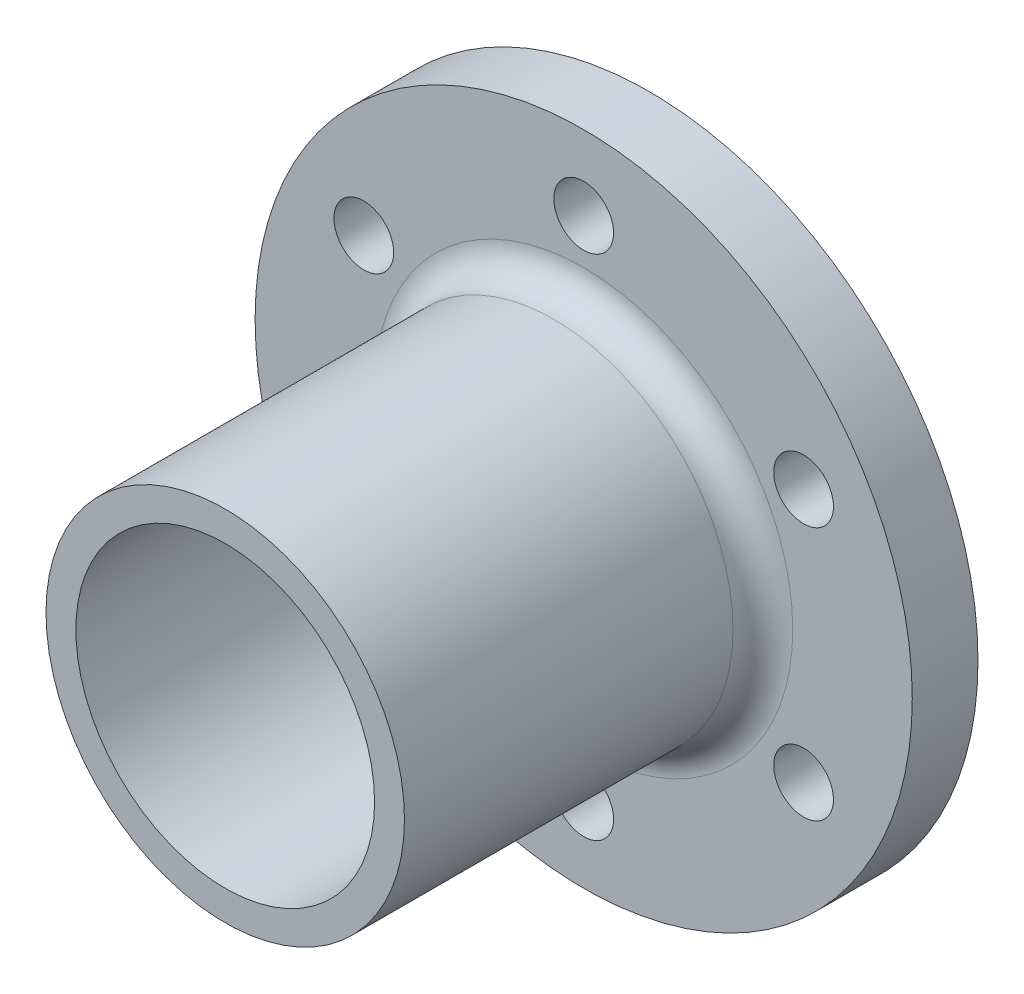
ISO-10303-21;
HEADER;
FILE_DESCRIPTION(('STEP AP214'),'2;1');
FILE_NAME('part.step','',(''),(''),'','','');
FILE_SCHEMA(('AUTOMOTIVE_DESIGN { 1 0 10303 214 1 1 1 1 }'));
ENDSEC;
DATA;
#1=APPLICATION_CONTEXT('core data for automotive mechanical design processes');
#2=APPLICATION_PROTOCOL_DEFINITION('international standard','automotive_design',2000,#1);
#3=PRODUCT_CONTEXT('',#1,'mechanical');
#4=PRODUCT('Part','Part','',(#3));
#5=PRODUCT_RELATED_PRODUCT_CATEGORY('part','',(#4));
#6=PRODUCT_DEFINITION_FORMATION('','',#4);
#7=PRODUCT_DEFINITION_CONTEXT('part definition',#1,'design');
#8=PRODUCT_DEFINITION('design','',#6,#7);
#9=PRODUCT_DEFINITION_SHAPE('','',#8);
#10=(LENGTH_UNIT() NAMED_UNIT(*) SI_UNIT(.MILLI.,.METRE.));
#11=(NAMED_UNIT(*) PLANE_ANGLE_UNIT() SI_UNIT($,.RADIAN.));
#12=(NAMED_UNIT(*) SI_UNIT($,.STERADIAN.) SOLID_ANGLE_UNIT());
#13=UNCERTAINTY_MEASURE_WITH_UNIT(LENGTH_MEASURE(1.E-05),#10,'distance_accuracy_value','');
#14=(GEOMETRIC_REPRESENTATION_CONTEXT(3) GLOBAL_UNCERTAINTY_ASSIGNED_CONTEXT((#13)) GLOBAL_UNIT_ASSIGNED_CONTEXT((#10,
#11,#12)) REPRESENTATION_CONTEXT('',''));
#15=CARTESIAN_POINT('',(0.,0.,0.));
#16=DIRECTION('',(0.,0.,1.));
#17=DIRECTION('',(1.,0.,0.));
#18=AXIS2_PLACEMENT_3D('',#15,#16,#17);
#19=CARTESIAN_POINT('',(0.,0.,22.));
#20=DIRECTION('',(0.,0.,-1.));
#21=DIRECTION('',(-1.,0.,0.));
#22=AXIS2_PLACEMENT_3D('',#19,#20,#21);
#23=CYLINDRICAL_SURFACE('',#22,110.);
#24=CARTESIAN_POINT('',(0.,0.,22.));
#25=DIRECTION('',(0.,0.,1.));
#26=DIRECTION('',(1.,0.,0.));
#27=AXIS2_PLACEMENT_3D('',#24,#25,#26);
#28=CIRCLE('',#27,110.);
#29=CARTESIAN_POINT('',(110.,0.,22.));
#30=VERTEX_POINT('',#29);
#31=EDGE_CURVE('E59',#30,#30,#28,.T.);
#32=ORIENTED_EDGE('',*,*,#31,.F.);
#33=EDGE_LOOP('',(#32));
#34=FACE_BOUND('',#33,.T.);
#35=CARTESIAN_POINT('',(0.,0.,0.));
#36=DIRECTION('',(0.,0.,1.));
#37=DIRECTION('',(1.,0.,0.));
#38=AXIS2_PLACEMENT_3D('',#35,#36,#37);
#39=CIRCLE('',#38,110.);
#40=CARTESIAN_POINT('',(110.,0.,0.));
#41=VERTEX_POINT('',#40);
#42=EDGE_CURVE('E63',#41,#41,#39,.T.);
#43=ORIENTED_EDGE('',*,*,#42,.T.);
#44=EDGE_LOOP('',(#43));
#45=FACE_BOUND('',#44,.T.);
#46=ADVANCED_FACE('F48',(#34,#45),#23,.T.);
#47=CARTESIAN_POINT('',(0.,0.,22.));
#48=DIRECTION('',(0.,0.,1.));
#49=DIRECTION('',(1.,0.,0.));
#50=AXIS2_PLACEMENT_3D('',#47,#48,#49);
#51=PLANE('',#50);
#52=CARTESIAN_POINT('',(0.,0.,22.));
#53=DIRECTION('',(0.,0.,1.));
#54=DIRECTION('',(1.,0.,0.));
#55=AXIS2_PLACEMENT_3D('',#52,#53,#54);
#56=CIRCLE('',#55,70.);
#57=CARTESIAN_POINT('',(70.,0.,22.));
#58=VERTEX_POINT('',#57);
#59=EDGE_CURVE('E12',#58,#58,#56,.F.);
#60=ORIENTED_EDGE('',*,*,#59,.T.);
#61=EDGE_LOOP('',(#60));
#62=FACE_BOUND('',#61,.T.);
#63=CARTESIAN_POINT('',(0.,85.,22.));
#64=DIRECTION('',(0.,0.,1.));
#65=DIRECTION('',(1.,0.,0.));
#66=AXIS2_PLACEMENT_3D('',#63,#64,#65);
#67=CIRCLE('',#66,10.);
#68=CARTESIAN_POINT('',(10.,85.,22.));
#69=VERTEX_POINT('',#68);
#70=EDGE_CURVE('E103',#69,#69,#67,.T.);
#71=ORIENTED_EDGE('',*,*,#70,.F.);
#72=EDGE_LOOP('',(#71));
#73=FACE_BOUND('',#72,.T.);
#74=CARTESIAN_POINT('',(-73.6121593216755,42.4999999999968,22.));
#75=DIRECTION('',(0.,0.,1.));
#76=DIRECTION('',(1.,0.,0.));
#77=AXIS2_PLACEMENT_3D('',#74,#75,#76);
#78=CIRCLE('',#77,10.0000000000036);
#79=CARTESIAN_POINT('',(-63.6121593216719,42.4999999999968,22.));
#80=VERTEX_POINT('',#79);
#81=EDGE_CURVE('E104',#80,#80,#78,.T.);
#82=ORIENTED_EDGE('',*,*,#81,.F.);
#83=EDGE_LOOP('',(#82));
#84=FACE_BOUND('',#83,.T.);
#85=CARTESIAN_POINT('',(-73.6121593216719,-42.5000000000032,22.));
#86=DIRECTION('',(0.,0.,1.));
#87=DIRECTION('',(1.,0.,0.));
#88=AXIS2_PLACEMENT_3D('',#85,#86,#87);
#89=CIRCLE('',#88,10.0000000000069);
#90=CARTESIAN_POINT('',(-63.612159321665,-42.5000000000032,22.));
#91=VERTEX_POINT('',#90);
#92=EDGE_CURVE('E78',#91,#91,#89,.T.);
#93=ORIENTED_EDGE('',*,*,#92,.F.);
#94=EDGE_LOOP('',(#93));
#95=FACE_BOUND('',#94,.T.);
#96=CARTESIAN_POINT('',(7.21630741137477E-12,-85.,22.));
#97=DIRECTION('',(0.,0.,1.));
#98=DIRECTION('',(1.,0.,0.));
#99=AXIS2_PLACEMENT_3D('',#96,#97,#98);
#100=CIRCLE('',#99,10.0000000000075);
#101=CARTESIAN_POINT('',(10.0000000000147,-85.,22.));
#102=VERTEX_POINT('',#101);
#103=EDGE_CURVE('E85',#102,#102,#100,.T.);
#104=ORIENTED_EDGE('',*,*,#103,.F.);
#105=EDGE_LOOP('',(#104));
#106=FACE_BOUND('',#105,.T.);
#107=CARTESIAN_POINT('',(73.6121593216827,-42.4999999999969,22.));
#108=DIRECTION('',(0.,0.,1.));
#109=DIRECTION('',(1.,0.,0.));
#110=AXIS2_PLACEMENT_3D('',#107,#108,#109);
#111=CIRCLE('',#110,10.0000000000046);
#112=CARTESIAN_POINT('',(83.6121593216873,-42.4999999999969,22.));
#113=VERTEX_POINT('',#112);
#114=EDGE_CURVE('E91',#113,#113,#111,.T.);
#115=ORIENTED_EDGE('',*,*,#114,.F.);
#116=EDGE_LOOP('',(#115));
#117=FACE_BOUND('',#116,.T.);
#118=CARTESIAN_POINT('',(73.6121593216791,42.5000000000031,22.));
#119=DIRECTION('',(0.,0.,1.));
#120=DIRECTION('',(1.,0.,0.));
#121=AXIS2_PLACEMENT_3D('',#118,#119,#120);
#122=CIRCLE('',#121,10.000000000001);
#123=CARTESIAN_POINT('',(83.6121593216801,42.5000000000031,22.));
#124=VERTEX_POINT('',#123);
#125=EDGE_CURVE('E97',#124,#124,#122,.T.);
#126=ORIENTED_EDGE('',*,*,#125,.F.);
#127=EDGE_LOOP('',(#126));
#128=FACE_BOUND('',#127,.T.);
#129=ORIENTED_EDGE('',*,*,#31,.T.);
#130=EDGE_LOOP('',(#129));
#131=FACE_BOUND('',#130,.T.);
#132=ADVANCED_FACE('F124',(#62,#73,#84,#95,#106,#117,#128,#131),#51,.T.);
#133=CARTESIAN_POINT('',(0.,0.,0.));
#134=DIRECTION('',(0.,0.,1.));
#135=DIRECTION('',(1.,0.,0.));
#136=AXIS2_PLACEMENT_3D('',#133,#134,#135);
#137=PLANE('',#136);
#138=CARTESIAN_POINT('',(0.,85.,0.));
#139=DIRECTION('',(0.,0.,1.));
#140=DIRECTION('',(1.,0.,0.));
#141=AXIS2_PLACEMENT_3D('',#138,#139,#140);
#142=CIRCLE('',#141,10.);
#143=CARTESIAN_POINT('',(10.,85.,0.));
#144=VERTEX_POINT('',#143);
#145=EDGE_CURVE('E75',#144,#144,#142,.T.);
#146=ORIENTED_EDGE('',*,*,#145,.T.);
#147=EDGE_LOOP('',(#146));
#148=FACE_BOUND('',#147,.T.);
#149=CARTESIAN_POINT('',(-73.6121593216755,42.4999999999968,0.));
#150=DIRECTION('',(0.,0.,1.));
#151=DIRECTION('',(1.,0.,0.));
#152=AXIS2_PLACEMENT_3D('',#149,#150,#151);
#153=CIRCLE('',#152,10.0000000000036);
#154=CARTESIAN_POINT('',(-63.6121593216719,42.4999999999968,0.));
#155=VERTEX_POINT('',#154);
#156=EDGE_CURVE('E82',#155,#155,#153,.T.);
#157=ORIENTED_EDGE('',*,*,#156,.T.);
#158=EDGE_LOOP('',(#157));
#159=FACE_BOUND('',#158,.T.);
#160=CARTESIAN_POINT('',(-73.6121593216719,-42.5000000000032,0.));
#161=DIRECTION('',(0.,0.,1.));
#162=DIRECTION('',(1.,0.,0.));
#163=AXIS2_PLACEMENT_3D('',#160,#161,#162);
#164=CIRCLE('',#163,10.0000000000069);
#165=CARTESIAN_POINT('',(-63.612159321665,-42.5000000000032,0.));
#166=VERTEX_POINT('',#165);
#167=EDGE_CURVE('E81',#166,#166,#164,.T.);
#168=ORIENTED_EDGE('',*,*,#167,.T.);
#169=EDGE_LOOP('',(#168));
#170=FACE_BOUND('',#169,.T.);
#171=CARTESIAN_POINT('',(7.21630741137477E-12,-85.,0.));
#172=DIRECTION('',(0.,0.,1.));
#173=DIRECTION('',(1.,0.,0.));
#174=AXIS2_PLACEMENT_3D('',#171,#172,#173);
#175=CIRCLE('',#174,10.0000000000075);
#176=CARTESIAN_POINT('',(10.0000000000147,-85.,0.));
#177=VERTEX_POINT('',#176);
#178=EDGE_CURVE('E88',#177,#177,#175,.T.);
#179=ORIENTED_EDGE('',*,*,#178,.T.);
#180=EDGE_LOOP('',(#179));
#181=FACE_BOUND('',#180,.T.);
#182=CARTESIAN_POINT('',(73.6121593216827,-42.4999999999969,0.));
#183=DIRECTION('',(0.,0.,1.));
#184=DIRECTION('',(1.,0.,0.));
#185=AXIS2_PLACEMENT_3D('',#182,#183,#184);
#186=CIRCLE('',#185,10.0000000000046);
#187=CARTESIAN_POINT('',(83.6121593216873,-42.4999999999969,0.));
#188=VERTEX_POINT('',#187);
#189=EDGE_CURVE('E94',#188,#188,#186,.T.);
#190=ORIENTED_EDGE('',*,*,#189,.T.);
#191=EDGE_LOOP('',(#190));
#192=FACE_BOUND('',#191,.T.);
#193=CARTESIAN_POINT('',(73.6121593216791,42.5000000000031,0.));
#194=DIRECTION('',(0.,0.,1.));
#195=DIRECTION('',(1.,0.,0.));
#196=AXIS2_PLACEMENT_3D('',#193,#194,#195);
#197=CIRCLE('',#196,10.000000000001);
#198=CARTESIAN_POINT('',(83.6121593216801,42.5000000000031,0.));
#199=VERTEX_POINT('',#198);
#200=EDGE_CURVE('E100',#199,#199,#197,.T.);
#201=ORIENTED_EDGE('',*,*,#200,.T.);
#202=EDGE_LOOP('',(#201));
#203=FACE_BOUND('',#202,.T.);
#204=CARTESIAN_POINT('',(0.,0.,0.));
#205=DIRECTION('',(0.,0.,1.));
#206=DIRECTION('',(1.,0.,0.));
#207=AXIS2_PLACEMENT_3D('',#204,#205,#206);
#208=CIRCLE('',#207,50.);
#209=CARTESIAN_POINT('',(50.,0.,0.));
#210=VERTEX_POINT('',#209);
#211=EDGE_CURVE('E71',#210,#210,#208,.T.);
#212=ORIENTED_EDGE('',*,*,#211,.T.);
#213=EDGE_LOOP('',(#212));
#214=FACE_BOUND('',#213,.T.);
#215=ORIENTED_EDGE('',*,*,#42,.F.);
#216=EDGE_LOOP('',(#215));
#217=FACE_BOUND('',#216,.T.);
#218=ADVANCED_FACE('F114',(#148,#159,#170,#181,#192,#203,#214,#217),#137,.F.);
#219=CARTESIAN_POINT('',(0.,0.,142.));
#220=DIRECTION('',(0.,0.,-1.));
#221=DIRECTION('',(-1.,0.,0.));
#222=AXIS2_PLACEMENT_3D('',#219,#220,#221);
#223=CYLINDRICAL_SURFACE('',#222,60.);
#224=CARTESIAN_POINT('',(0.,0.,32.));
#225=DIRECTION('',(0.,0.,1.));
#226=DIRECTION('',(1.,0.,0.));
#227=AXIS2_PLACEMENT_3D('',#224,#225,#226);
#228=CIRCLE('',#227,60.);
#229=CARTESIAN_POINT('',(60.,0.,32.));
#230=VERTEX_POINT('',#229);
#231=EDGE_CURVE('E55',#230,#230,#228,.T.);
#232=ORIENTED_EDGE('',*,*,#231,.T.);
#233=EDGE_LOOP('',(#232));
#234=FACE_BOUND('',#233,.T.);
#235=CARTESIAN_POINT('',(0.,0.,142.));
#236=DIRECTION('',(0.,0.,1.));
#237=DIRECTION('',(1.,0.,0.));
#238=AXIS2_PLACEMENT_3D('',#235,#236,#237);
#239=CIRCLE('',#238,60.);
#240=CARTESIAN_POINT('',(60.,0.,142.));
#241=VERTEX_POINT('',#240);
#242=EDGE_CURVE('E67',#241,#241,#239,.T.);
#243=ORIENTED_EDGE('',*,*,#242,.F.);
#244=EDGE_LOOP('',(#243));
#245=FACE_BOUND('',#244,.T.);
#246=ADVANCED_FACE('F145',(#234,#245),#223,.T.);
#247=CARTESIAN_POINT('',(0.,0.,142.));
#248=DIRECTION('',(0.,0.,1.));
#249=DIRECTION('',(1.,0.,0.));
#250=AXIS2_PLACEMENT_3D('',#247,#248,#249);
#251=PLANE('',#250);
#252=CARTESIAN_POINT('',(0.,0.,142.));
#253=DIRECTION('',(0.,0.,1.));
#254=DIRECTION('',(1.,0.,0.));
#255=AXIS2_PLACEMENT_3D('',#252,#253,#254);
#256=CIRCLE('',#255,50.);
#257=CARTESIAN_POINT('',(50.,0.,142.));
#258=VERTEX_POINT('',#257);
#259=EDGE_CURVE('E72',#258,#258,#256,.T.);
#260=ORIENTED_EDGE('',*,*,#259,.F.);
#261=EDGE_LOOP('',(#260));
#262=FACE_BOUND('',#261,.T.);
#263=ORIENTED_EDGE('',*,*,#242,.T.);
#264=EDGE_LOOP('',(#263));
#265=FACE_BOUND('',#264,.T.);
#266=ADVANCED_FACE('F150',(#262,#265),#251,.T.);
#267=CARTESIAN_POINT('',(0.,0.,0.));
#268=DIRECTION('',(0.,0.,1.));
#269=DIRECTION('',(1.,0.,0.));
#270=AXIS2_PLACEMENT_3D('',#267,#268,#269);
#271=CYLINDRICAL_SURFACE('',#270,50.);
#272=ORIENTED_EDGE('',*,*,#211,.F.);
#273=EDGE_LOOP('',(#272));
#274=FACE_BOUND('',#273,.T.);
#275=ORIENTED_EDGE('',*,*,#259,.T.);
#276=EDGE_LOOP('',(#275));
#277=FACE_BOUND('',#276,.T.);
#278=ADVANCED_FACE('F155',(#274,#277),#271,.F.);
#279=CARTESIAN_POINT('',(73.6121593216791,42.5000000000031,0.));
#280=DIRECTION('',(0.,0.,1.));
#281=DIRECTION('',(1.,0.,0.));
#282=AXIS2_PLACEMENT_3D('',#279,#280,#281);
#283=CYLINDRICAL_SURFACE('',#282,10.000000000001);
#284=ORIENTED_EDGE('',*,*,#200,.F.);
#285=EDGE_LOOP('',(#284));
#286=FACE_BOUND('',#285,.T.);
#287=ORIENTED_EDGE('',*,*,#125,.T.);
#288=EDGE_LOOP('',(#287));
#289=FACE_BOUND('',#288,.T.);
#290=ADVANCED_FACE('F159',(#286,#289),#283,.F.);
#291=CARTESIAN_POINT('',(73.6121593216827,-42.4999999999969,0.));
#292=DIRECTION('',(0.,0.,1.));
#293=DIRECTION('',(1.,0.,0.));
#294=AXIS2_PLACEMENT_3D('',#291,#292,#293);
#295=CYLINDRICAL_SURFACE('',#294,10.0000000000046);
#296=ORIENTED_EDGE('',*,*,#189,.F.);
#297=EDGE_LOOP('',(#296));
#298=FACE_BOUND('',#297,.T.);
#299=ORIENTED_EDGE('',*,*,#114,.T.);
#300=EDGE_LOOP('',(#299));
#301=FACE_BOUND('',#300,.T.);
#302=ADVANCED_FACE('F168',(#298,#301),#295,.F.);
#303=CARTESIAN_POINT('',(7.21630741137477E-12,-85.,0.));
#304=DIRECTION('',(0.,0.,1.));
#305=DIRECTION('',(1.,0.,0.));
#306=AXIS2_PLACEMENT_3D('',#303,#304,#305);
#307=CYLINDRICAL_SURFACE('',#306,10.0000000000075);
#308=ORIENTED_EDGE('',*,*,#178,.F.);
#309=EDGE_LOOP('',(#308));
#310=FACE_BOUND('',#309,.T.);
#311=ORIENTED_EDGE('',*,*,#103,.T.);
#312=EDGE_LOOP('',(#311));
#313=FACE_BOUND('',#312,.T.);
#314=ADVANCED_FACE('F164',(#310,#313),#307,.F.);
#315=CARTESIAN_POINT('',(-73.6121593216719,-42.5000000000032,0.));
#316=DIRECTION('',(0.,0.,1.));
#317=DIRECTION('',(1.,0.,0.));
#318=AXIS2_PLACEMENT_3D('',#315,#316,#317);
#319=CYLINDRICAL_SURFACE('',#318,10.0000000000069);
#320=ORIENTED_EDGE('',*,*,#167,.F.);
#321=EDGE_LOOP('',(#320));
#322=FACE_BOUND('',#321,.T.);
#323=ORIENTED_EDGE('',*,*,#92,.T.);
#324=EDGE_LOOP('',(#323));
#325=FACE_BOUND('',#324,.T.);
#326=ADVANCED_FACE('F161',(#322,#325),#319,.F.);
#327=CARTESIAN_POINT('',(-73.6121593216755,42.4999999999968,0.));
#328=DIRECTION('',(0.,0.,1.));
#329=DIRECTION('',(1.,0.,0.));
#330=AXIS2_PLACEMENT_3D('',#327,#328,#329);
#331=CYLINDRICAL_SURFACE('',#330,10.0000000000036);
#332=ORIENTED_EDGE('',*,*,#156,.F.);
#333=EDGE_LOOP('',(#332));
#334=FACE_BOUND('',#333,.T.);
#335=ORIENTED_EDGE('',*,*,#81,.T.);
#336=EDGE_LOOP('',(#335));
#337=FACE_BOUND('',#336,.T.);
#338=ADVANCED_FACE('F120',(#334,#337),#331,.F.);
#339=CARTESIAN_POINT('',(0.,85.,0.));
#340=DIRECTION('',(0.,0.,1.));
#341=DIRECTION('',(1.,0.,0.));
#342=AXIS2_PLACEMENT_3D('',#339,#340,#341);
#343=CYLINDRICAL_SURFACE('',#342,10.);
#344=ORIENTED_EDGE('',*,*,#145,.F.);
#345=EDGE_LOOP('',(#344));
#346=FACE_BOUND('',#345,.T.);
#347=ORIENTED_EDGE('',*,*,#70,.T.);
#348=EDGE_LOOP('',(#347));
#349=FACE_BOUND('',#348,.T.);
#350=ADVANCED_FACE('F117',(#346,#349),#343,.F.);
#351=CARTESIAN_POINT('',(0.,0.,32.));
#352=DIRECTION('',(0.,0.,1.));
#353=DIRECTION('',(1.,0.,0.));
#354=AXIS2_PLACEMENT_3D('',#351,#352,#353);
#355=TOROIDAL_SURFACE('',#354,70.,10.);
#356=ORIENTED_EDGE('',*,*,#59,.F.);
#357=EDGE_LOOP('',(#356));
#358=FACE_BOUND('',#357,.T.);
#359=ORIENTED_EDGE('',*,*,#231,.F.);
#360=EDGE_LOOP('',(#359));
#361=FACE_BOUND('',#360,.T.);
#362=ADVANCED_FACE('F50',(#358,#361),#355,.F.);
#363=CLOSED_SHELL('',(#46,#132,#218,#246,#266,#278,#290,#302,#314,#326,#338,#350,#362));
#364=MANIFOLD_SOLID_BREP('B2',#363);
#365=ADVANCED_BREP_SHAPE_REPRESENTATION('',(#18,#364),#14);
#366=SHAPE_DEFINITION_REPRESENTATION(#9,#365);
ENDSEC;
END-ISO-10303-21;
